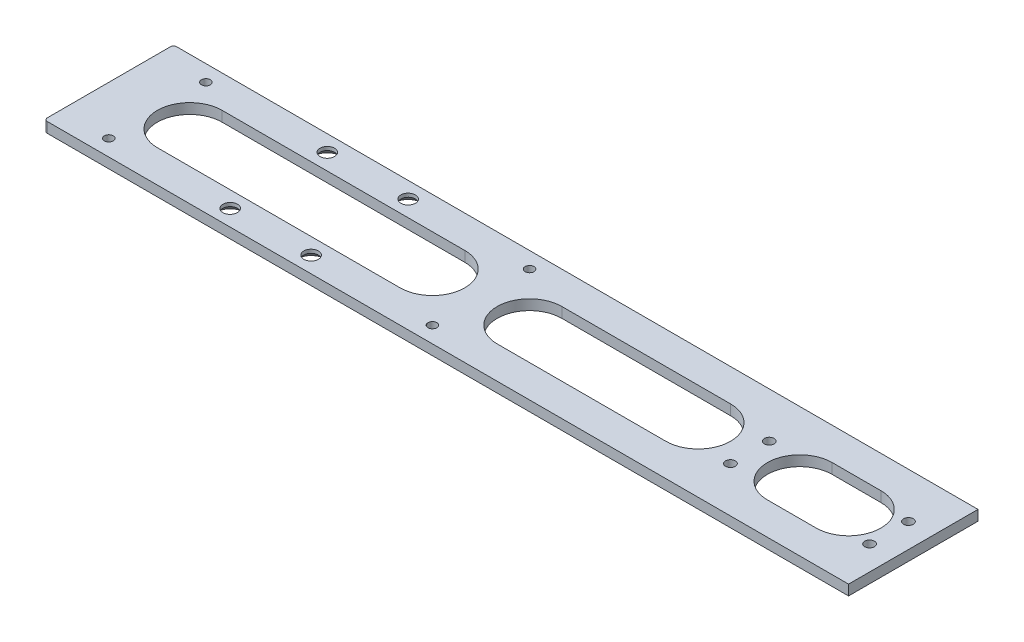
ISO-10303-21;
HEADER;
FILE_DESCRIPTION(('STEP AP214'),'2;1');
FILE_NAME('part.step','',(''),(''),'','','');
FILE_SCHEMA(('AUTOMOTIVE_DESIGN { 1 0 10303 214 1 1 1 1 }'));
ENDSEC;
DATA;
#1=APPLICATION_CONTEXT('core data for automotive mechanical design processes');
#2=APPLICATION_PROTOCOL_DEFINITION('international standard','automotive_design',2000,#1);
#3=PRODUCT_CONTEXT('',#1,'mechanical');
#4=PRODUCT('Part','Part','',(#3));
#5=PRODUCT_RELATED_PRODUCT_CATEGORY('part','',(#4));
#6=PRODUCT_DEFINITION_FORMATION('','',#4);
#7=PRODUCT_DEFINITION_CONTEXT('part definition',#1,'design');
#8=PRODUCT_DEFINITION('design','',#6,#7);
#9=PRODUCT_DEFINITION_SHAPE('','',#8);
#10=(LENGTH_UNIT() NAMED_UNIT(*) SI_UNIT(.MILLI.,.METRE.));
#11=(NAMED_UNIT(*) PLANE_ANGLE_UNIT() SI_UNIT($,.RADIAN.));
#12=(NAMED_UNIT(*) SI_UNIT($,.STERADIAN.) SOLID_ANGLE_UNIT());
#13=UNCERTAINTY_MEASURE_WITH_UNIT(LENGTH_MEASURE(1.E-05),#10,'distance_accuracy_value','');
#14=(GEOMETRIC_REPRESENTATION_CONTEXT(3) GLOBAL_UNCERTAINTY_ASSIGNED_CONTEXT((#13)) GLOBAL_UNIT_ASSIGNED_CONTEXT((#10,
#11,#12)) REPRESENTATION_CONTEXT('',''));
#15=CARTESIAN_POINT('',(0.,0.,0.));
#16=DIRECTION('',(0.,0.,1.));
#17=DIRECTION('',(1.,0.,0.));
#18=AXIS2_PLACEMENT_3D('',#15,#16,#17);
#19=CARTESIAN_POINT('',(5.22222222222225,12.7279220613579,35.5555555555555));
#20=DIRECTION('',(0.,-1.,0.));
#21=DIRECTION('',(0.,0.,-1.));
#22=AXIS2_PLACEMENT_3D('',#19,#20,#21);
#23=CYLINDRICAL_SURFACE('',#22,4.50000000000001);
#24=CARTESIAN_POINT('',(5.22222222222225,0.,35.5555555555555));
#25=DIRECTION('',(0.,1.,0.));
#26=DIRECTION('',(0.,0.,1.));
#27=AXIS2_PLACEMENT_3D('',#24,#25,#26);
#28=CIRCLE('',#27,4.50000000000001);
#29=CARTESIAN_POINT('',(5.22222222222225,0.,40.0555555555555));
#30=VERTEX_POINT('',#29);
#31=EDGE_CURVE('E378',#30,#30,#28,.T.);
#32=ORIENTED_EDGE('',*,*,#31,.T.);
#33=EDGE_LOOP('',(#32));
#34=FACE_BOUND('',#33,.T.);
#35=CARTESIAN_POINT('',(5.22222222222225,-2.2,35.5555555555555));
#36=DIRECTION('',(0.,-1.,0.));
#37=DIRECTION('',(0.,0.,-1.));
#38=AXIS2_PLACEMENT_3D('',#35,#36,#37);
#39=CIRCLE('',#38,4.5);
#40=CARTESIAN_POINT('',(5.22222222222225,-2.2,31.0555555555555));
#41=VERTEX_POINT('',#40);
#42=EDGE_CURVE('E669',#41,#41,#39,.T.);
#43=ORIENTED_EDGE('',*,*,#42,.T.);
#44=EDGE_LOOP('',(#43));
#45=FACE_BOUND('',#44,.T.);
#46=ADVANCED_FACE('F40',(#34,#45),#23,.F.);
#47=CARTESIAN_POINT('',(0.,-6.35,0.));
#48=DIRECTION('',(0.,1.,0.));
#49=DIRECTION('',(0.,0.,1.));
#50=AXIS2_PLACEMENT_3D('',#47,#48,#49);
#51=PLANE('',#50);
#52=CARTESIAN_POINT('',(5.22222222222225,-6.35,35.5555555555555));
#53=DIRECTION('',(0.,-1.,0.));
#54=DIRECTION('',(0.,0.,-1.));
#55=AXIS2_PLACEMENT_3D('',#52,#53,#54);
#56=CIRCLE('',#55,8.65);
#57=CARTESIAN_POINT('',(5.22222222222225,-6.35,26.9055555555555));
#58=VERTEX_POINT('',#57);
#59=EDGE_CURVE('E672',#58,#58,#56,.T.);
#60=ORIENTED_EDGE('',*,*,#59,.F.);
#61=EDGE_LOOP('',(#60));
#62=FACE_BOUND('',#61,.T.);
#63=CARTESIAN_POINT('',(-44.7777777777778,-6.35,35.5555555555555));
#64=DIRECTION('',(0.,-1.,0.));
#65=DIRECTION('',(0.,0.,-1.));
#66=AXIS2_PLACEMENT_3D('',#63,#64,#65);
#67=CIRCLE('',#66,8.65);
#68=CARTESIAN_POINT('',(-44.7777777777778,-6.35,26.9055555555555));
#69=VERTEX_POINT('',#68);
#70=EDGE_CURVE('E674',#69,#69,#67,.T.);
#71=ORIENTED_EDGE('',*,*,#70,.F.);
#72=EDGE_LOOP('',(#71));
#73=FACE_BOUND('',#72,.T.);
#74=CARTESIAN_POINT('',(-44.7777777777778,-6.35,-24.4444444444445));
#75=DIRECTION('',(0.,-1.,0.));
#76=DIRECTION('',(0.,0.,-1.));
#77=AXIS2_PLACEMENT_3D('',#74,#75,#76);
#78=CIRCLE('',#77,8.65);
#79=CARTESIAN_POINT('',(-44.7777777777778,-6.35,-33.0944444444445));
#80=VERTEX_POINT('',#79);
#81=EDGE_CURVE('E374',#80,#80,#78,.T.);
#82=ORIENTED_EDGE('',*,*,#81,.F.);
#83=EDGE_LOOP('',(#82));
#84=FACE_BOUND('',#83,.T.);
#85=DIRECTION('',(0.,0.,1.));
#86=VECTOR('',#85,1.);
#87=CARTESIAN_POINT('',(-149.777777777778,-6.35,-34.4444444444445));
#88=LINE('',#87,#86);
#89=CARTESIAN_POINT('',(-149.777777777778,-6.35,-32.4444444444445));
#90=VERTEX_POINT('',#89);
#91=CARTESIAN_POINT('',(-149.777777777778,-6.35,43.5555555555555));
#92=VERTEX_POINT('',#91);
#93=EDGE_CURVE('E259',#90,#92,#88,.T.);
#94=ORIENTED_EDGE('',*,*,#93,.F.);
#95=CARTESIAN_POINT('',(-147.777777777778,-6.35,-32.4444444444445));
#96=DIRECTION('',(0.,1.,0.));
#97=DIRECTION('',(0.,0.,1.));
#98=AXIS2_PLACEMENT_3D('',#95,#96,#97);
#99=CIRCLE('',#98,2.);
#100=CARTESIAN_POINT('',(-147.777777777778,-6.35,-34.4444444444445));
#101=VERTEX_POINT('',#100);
#102=EDGE_CURVE('E299',#90,#101,#99,.F.);
#103=ORIENTED_EDGE('',*,*,#102,.T.);
#104=DIRECTION('',(-1.,0.,0.));
#105=VECTOR('',#104,1.);
#106=CARTESIAN_POINT('',(-149.777777777778,-6.35,-34.4444444444445));
#107=LINE('',#106,#105);
#108=CARTESIAN_POINT('',(347.372222222222,-6.35,-34.4444444444445));
#109=VERTEX_POINT('',#108);
#110=EDGE_CURVE('E268',#109,#101,#107,.T.);
#111=ORIENTED_EDGE('',*,*,#110,.F.);
#112=DIRECTION('',(0.,0.,-1.));
#113=VECTOR('',#112,1.);
#114=CARTESIAN_POINT('',(347.372222222222,-6.35,-34.4444444444445));
#115=LINE('',#114,#113);
#116=CARTESIAN_POINT('',(347.372222222222,-6.35,45.5555555555555));
#117=VERTEX_POINT('',#116);
#118=EDGE_CURVE('E265',#117,#109,#115,.T.);
#119=ORIENTED_EDGE('',*,*,#118,.F.);
#120=DIRECTION('',(1.,0.,0.));
#121=VECTOR('',#120,1.);
#122=CARTESIAN_POINT('',(-149.777777777778,-6.35,45.5555555555555));
#123=LINE('',#122,#121);
#124=CARTESIAN_POINT('',(-147.777777777778,-6.35,45.5555555555555));
#125=VERTEX_POINT('',#124);
#126=EDGE_CURVE('E262',#125,#117,#123,.T.);
#127=ORIENTED_EDGE('',*,*,#126,.F.);
#128=CARTESIAN_POINT('',(-147.777777777778,-6.35,43.5555555555555));
#129=DIRECTION('',(0.,1.,0.));
#130=DIRECTION('',(0.,0.,1.));
#131=AXIS2_PLACEMENT_3D('',#128,#129,#130);
#132=CIRCLE('',#131,2.);
#133=EDGE_CURVE('E297',#125,#92,#132,.F.);
#134=ORIENTED_EDGE('',*,*,#133,.T.);
#135=EDGE_LOOP('',(#94,#103,#111,#119,#127,#134));
#136=FACE_BOUND('',#135,.T.);
#137=CARTESIAN_POINT('',(80.2222222222222,-6.35,-24.4444444444445));
#138=DIRECTION('',(0.,1.,0.));
#139=DIRECTION('',(0.,0.,1.));
#140=AXIS2_PLACEMENT_3D('',#137,#138,#139);
#141=CIRCLE('',#140,2.75);
#142=CARTESIAN_POINT('',(80.2222222222222,-6.35,-21.6944444444445));
#143=VERTEX_POINT('',#142);
#144=EDGE_CURVE('E255',#143,#143,#141,.T.);
#145=ORIENTED_EDGE('',*,*,#144,.T.);
#146=EDGE_LOOP('',(#145));
#147=FACE_BOUND('',#146,.T.);
#148=CARTESIAN_POINT('',(80.2222222222222,-6.35,35.5555555555555));
#149=DIRECTION('',(0.,1.,0.));
#150=DIRECTION('',(0.,0.,1.));
#151=AXIS2_PLACEMENT_3D('',#148,#149,#150);
#152=CIRCLE('',#151,2.75);
#153=CARTESIAN_POINT('',(80.2222222222222,-6.35,38.3055555555555));
#154=VERTEX_POINT('',#153);
#155=EDGE_CURVE('E249',#154,#154,#152,.T.);
#156=ORIENTED_EDGE('',*,*,#155,.T.);
#157=EDGE_LOOP('',(#156));
#158=FACE_BOUND('',#157,.T.);
#159=CARTESIAN_POINT('',(-119.777777777778,-6.35,35.5555555555555));
#160=DIRECTION('',(0.,1.,0.));
#161=DIRECTION('',(0.,0.,1.));
#162=AXIS2_PLACEMENT_3D('',#159,#160,#161);
#163=CIRCLE('',#162,2.75);
#164=CARTESIAN_POINT('',(-119.777777777778,-6.35,38.3055555555555));
#165=VERTEX_POINT('',#164);
#166=EDGE_CURVE('E243',#165,#165,#163,.T.);
#167=ORIENTED_EDGE('',*,*,#166,.T.);
#168=EDGE_LOOP('',(#167));
#169=FACE_BOUND('',#168,.T.);
#170=CARTESIAN_POINT('',(-119.777777777778,-6.35,-24.4444444444445));
#171=DIRECTION('',(0.,1.,0.));
#172=DIRECTION('',(0.,0.,1.));
#173=AXIS2_PLACEMENT_3D('',#170,#171,#172);
#174=CIRCLE('',#173,2.75);
#175=CARTESIAN_POINT('',(-119.777777777778,-6.35,-21.6944444444445));
#176=VERTEX_POINT('',#175);
#177=EDGE_CURVE('E237',#176,#176,#174,.T.);
#178=ORIENTED_EDGE('',*,*,#177,.T.);
#179=EDGE_LOOP('',(#178));
#180=FACE_BOUND('',#179,.T.);
#181=DIRECTION('',(-1.,0.,0.));
#182=VECTOR('',#181,1.);
#183=CARTESIAN_POINT('',(307.372222222222,-6.35,25.5555555555555));
#184=LINE('',#183,#182);
#185=CARTESIAN_POINT('',(307.372222222222,-6.35,25.5555555555555));
#186=VERTEX_POINT('',#185);
#187=CARTESIAN_POINT('',(277.234752082904,-6.35,25.5555555555555));
#188=VERTEX_POINT('',#187);
#189=EDGE_CURVE('E216',#186,#188,#184,.T.);
#190=ORIENTED_EDGE('',*,*,#189,.F.);
#191=CARTESIAN_POINT('',(307.372222222222,-6.35,5.55555555555554));
#192=DIRECTION('',(0.,-1.,0.));
#193=DIRECTION('',(0.,0.,-1.));
#194=AXIS2_PLACEMENT_3D('',#191,#192,#193);
#195=CIRCLE('',#194,20.);
#196=CARTESIAN_POINT('',(307.372222222222,-6.35,-14.4444444444445));
#197=VERTEX_POINT('',#196);
#198=EDGE_CURVE('E208',#197,#186,#195,.T.);
#199=ORIENTED_EDGE('',*,*,#198,.F.);
#200=DIRECTION('',(1.,0.,0.));
#201=VECTOR('',#200,1.);
#202=CARTESIAN_POINT('',(307.372222222222,-6.35,-14.4444444444445));
#203=LINE('',#202,#201);
#204=CARTESIAN_POINT('',(277.234752082904,-6.35,-14.4444444444445));
#205=VERTEX_POINT('',#204);
#206=EDGE_CURVE('E222',#205,#197,#203,.T.);
#207=ORIENTED_EDGE('',*,*,#206,.F.);
#208=CARTESIAN_POINT('',(277.234752082904,-6.35,5.55555555555554));
#209=DIRECTION('',(0.,-1.,0.));
#210=DIRECTION('',(0.,0.,-1.));
#211=AXIS2_PLACEMENT_3D('',#208,#209,#210);
#212=CIRCLE('',#211,20.);
#213=EDGE_CURVE('E219',#188,#205,#212,.T.);
#214=ORIENTED_EDGE('',*,*,#213,.F.);
#215=EDGE_LOOP('',(#190,#199,#207,#214));
#216=FACE_BOUND('',#215,.T.);
#217=DIRECTION('',(-1.,0.,0.));
#218=VECTOR('',#217,1.);
#219=CARTESIAN_POINT('',(50.2222222222222,-6.35,25.5555555555555));
#220=LINE('',#219,#218);
#221=CARTESIAN_POINT('',(50.2222222222222,-6.35,25.5555555555555));
#222=VERTEX_POINT('',#221);
#223=CARTESIAN_POINT('',(-99.7777777777778,-6.35,25.5555555555555));
#224=VERTEX_POINT('',#223);
#225=EDGE_CURVE('E196',#222,#224,#220,.T.);
#226=ORIENTED_EDGE('',*,*,#225,.F.);
#227=CARTESIAN_POINT('',(50.2222222222222,-6.35,5.55555555555554));
#228=DIRECTION('',(0.,-1.,0.));
#229=DIRECTION('',(0.,0.,-1.));
#230=AXIS2_PLACEMENT_3D('',#227,#228,#229);
#231=CIRCLE('',#230,20.);
#232=CARTESIAN_POINT('',(50.2222222222222,-6.35,-14.4444444444445));
#233=VERTEX_POINT('',#232);
#234=EDGE_CURVE('E192',#233,#222,#231,.T.);
#235=ORIENTED_EDGE('',*,*,#234,.F.);
#236=DIRECTION('',(1.,0.,0.));
#237=VECTOR('',#236,1.);
#238=CARTESIAN_POINT('',(50.2222222222222,-6.35,-14.4444444444445));
#239=LINE('',#238,#237);
#240=CARTESIAN_POINT('',(-99.7777777777778,-6.35,-14.4444444444445));
#241=VERTEX_POINT('',#240);
#242=EDGE_CURVE('E202',#241,#233,#239,.T.);
#243=ORIENTED_EDGE('',*,*,#242,.F.);
#244=CARTESIAN_POINT('',(-99.7777777777778,-6.35,5.55555555555554));
#245=DIRECTION('',(0.,-1.,0.));
#246=DIRECTION('',(0.,0.,-1.));
#247=AXIS2_PLACEMENT_3D('',#244,#245,#246);
#248=CIRCLE('',#247,20.);
#249=EDGE_CURVE('E199',#224,#241,#248,.T.);
#250=ORIENTED_EDGE('',*,*,#249,.F.);
#251=EDGE_LOOP('',(#226,#235,#243,#250));
#252=FACE_BOUND('',#251,.T.);
#253=DIRECTION('',(-1.,0.,0.));
#254=VECTOR('',#253,1.);
#255=CARTESIAN_POINT('',(214.481912447297,-6.35,25.5555555555555));
#256=LINE('',#255,#254);
#257=CARTESIAN_POINT('',(214.481912447297,-6.35,25.5555555555555));
#258=VERTEX_POINT('',#257);
#259=CARTESIAN_POINT('',(110.222222222222,-6.35,25.5555555555555));
#260=VERTEX_POINT('',#259);
#261=EDGE_CURVE('E178',#258,#260,#256,.T.);
#262=ORIENTED_EDGE('',*,*,#261,.F.);
#263=CARTESIAN_POINT('',(214.481912447297,-6.35,5.55555555555554));
#264=DIRECTION('',(0.,-1.,0.));
#265=DIRECTION('',(0.,0.,-1.));
#266=AXIS2_PLACEMENT_3D('',#263,#264,#265);
#267=CIRCLE('',#266,20.);
#268=CARTESIAN_POINT('',(214.481912447297,-6.35,-14.4444444444445));
#269=VERTEX_POINT('',#268);
#270=EDGE_CURVE('E57',#269,#258,#267,.T.);
#271=ORIENTED_EDGE('',*,*,#270,.F.);
#272=DIRECTION('',(1.,0.,0.));
#273=VECTOR('',#272,1.);
#274=CARTESIAN_POINT('',(214.481912447297,-6.35,-14.4444444444445));
#275=LINE('',#274,#273);
#276=CARTESIAN_POINT('',(110.222222222222,-6.35,-14.4444444444445));
#277=VERTEX_POINT('',#276);
#278=EDGE_CURVE('E185',#277,#269,#275,.T.);
#279=ORIENTED_EDGE('',*,*,#278,.F.);
#280=CARTESIAN_POINT('',(110.222222222222,-6.35,5.55555555555554));
#281=DIRECTION('',(0.,-1.,0.));
#282=DIRECTION('',(0.,0.,-1.));
#283=AXIS2_PLACEMENT_3D('',#280,#281,#282);
#284=CIRCLE('',#283,20.);
#285=EDGE_CURVE('E169',#260,#277,#284,.T.);
#286=ORIENTED_EDGE('',*,*,#285,.F.);
#287=EDGE_LOOP('',(#262,#271,#279,#286));
#288=FACE_BOUND('',#287,.T.);
#289=CARTESIAN_POINT('',(332.372222222222,-6.35,17.5555555555555));
#290=DIRECTION('',(0.,-1.,0.));
#291=DIRECTION('',(0.,0.,-1.));
#292=AXIS2_PLACEMENT_3D('',#289,#290,#291);
#293=CIRCLE('',#292,2.99999999999999);
#294=CARTESIAN_POINT('',(332.372222222222,-6.35,14.5555555555555));
#295=VERTEX_POINT('',#294);
#296=EDGE_CURVE('E328',#295,#295,#293,.T.);
#297=ORIENTED_EDGE('',*,*,#296,.F.);
#298=EDGE_LOOP('',(#297));
#299=FACE_BOUND('',#298,.T.);
#300=CARTESIAN_POINT('',(246.372222222222,-6.35,17.5555555555549));
#301=DIRECTION('',(0.,-1.,0.));
#302=DIRECTION('',(0.,0.,-1.));
#303=AXIS2_PLACEMENT_3D('',#300,#301,#302);
#304=CIRCLE('',#303,2.99999999999999);
#305=CARTESIAN_POINT('',(246.372222222222,-6.35,14.5555555555549));
#306=VERTEX_POINT('',#305);
#307=EDGE_CURVE('E331',#306,#306,#304,.T.);
#308=ORIENTED_EDGE('',*,*,#307,.F.);
#309=EDGE_LOOP('',(#308));
#310=FACE_BOUND('',#309,.T.);
#311=CARTESIAN_POINT('',(246.372222222222,-6.35,-6.44444444444506));
#312=DIRECTION('',(0.,-1.,0.));
#313=DIRECTION('',(0.,0.,-1.));
#314=AXIS2_PLACEMENT_3D('',#311,#312,#313);
#315=CIRCLE('',#314,2.99999999999999);
#316=CARTESIAN_POINT('',(246.372222222222,-6.35,-9.44444444444505));
#317=VERTEX_POINT('',#316);
#318=EDGE_CURVE('E334',#317,#317,#315,.T.);
#319=ORIENTED_EDGE('',*,*,#318,.F.);
#320=EDGE_LOOP('',(#319));
#321=FACE_BOUND('',#320,.T.);
#322=CARTESIAN_POINT('',(332.372222222222,-6.35,-6.44444444444446));
#323=DIRECTION('',(0.,-1.,0.));
#324=DIRECTION('',(0.,0.,-1.));
#325=AXIS2_PLACEMENT_3D('',#322,#323,#324);
#326=CIRCLE('',#325,2.99999999999999);
#327=CARTESIAN_POINT('',(332.372222222222,-6.35,-9.44444444444445));
#328=VERTEX_POINT('',#327);
#329=EDGE_CURVE('E344',#328,#328,#326,.T.);
#330=ORIENTED_EDGE('',*,*,#329,.F.);
#331=EDGE_LOOP('',(#330));
#332=FACE_BOUND('',#331,.T.);
#333=CARTESIAN_POINT('',(5.22222222222225,-6.35,-24.4444444444444));
#334=DIRECTION('',(0.,-1.,0.));
#335=DIRECTION('',(0.,0.,-1.));
#336=AXIS2_PLACEMENT_3D('',#333,#334,#335);
#337=CIRCLE('',#336,8.65);
#338=CARTESIAN_POINT('',(5.22222222222225,-6.35,-33.0944444444444));
#339=VERTEX_POINT('',#338);
#340=EDGE_CURVE('E365',#339,#339,#337,.T.);
#341=ORIENTED_EDGE('',*,*,#340,.F.);
#342=EDGE_LOOP('',(#341));
#343=FACE_BOUND('',#342,.T.);
#344=ADVANCED_FACE('F182',(#62,#73,#84,#136,#147,#158,#169,#180,#216,#252,#288,#299,#310,#321,
#332,#343),#51,.F.);
#345=CARTESIAN_POINT('',(0.,0.,0.));
#346=DIRECTION('',(0.,1.,0.));
#347=DIRECTION('',(0.,0.,1.));
#348=AXIS2_PLACEMENT_3D('',#345,#346,#347);
#349=PLANE('',#348);
#350=CARTESIAN_POINT('',(-44.7777777777778,0.,-24.4444444444445));
#351=DIRECTION('',(0.,1.,0.));
#352=DIRECTION('',(0.,0.,1.));
#353=AXIS2_PLACEMENT_3D('',#350,#351,#352);
#354=CIRCLE('',#353,4.5);
#355=CARTESIAN_POINT('',(-44.7777777777778,0.,-19.9444444444445));
#356=VERTEX_POINT('',#355);
#357=EDGE_CURVE('E371',#356,#356,#354,.F.);
#358=ORIENTED_EDGE('',*,*,#357,.T.);
#359=EDGE_LOOP('',(#358));
#360=FACE_BOUND('',#359,.T.);
#361=ORIENTED_EDGE('',*,*,#31,.F.);
#362=EDGE_LOOP('',(#361));
#363=FACE_BOUND('',#362,.T.);
#364=CARTESIAN_POINT('',(5.22222222222225,0.,-24.4444444444444));
#365=DIRECTION('',(0.,1.,0.));
#366=DIRECTION('',(0.,0.,1.));
#367=AXIS2_PLACEMENT_3D('',#364,#365,#366);
#368=CIRCLE('',#367,4.5);
#369=CARTESIAN_POINT('',(5.22222222222225,0.,-19.9444444444444));
#370=VERTEX_POINT('',#369);
#371=EDGE_CURVE('E381',#370,#370,#368,.F.);
#372=ORIENTED_EDGE('',*,*,#371,.T.);
#373=EDGE_LOOP('',(#372));
#374=FACE_BOUND('',#373,.T.);
#375=CARTESIAN_POINT('',(332.372222222222,0.,-6.44444444444446));
#376=DIRECTION('',(0.,1.,0.));
#377=DIRECTION('',(0.,0.,1.));
#378=AXIS2_PLACEMENT_3D('',#375,#376,#377);
#379=CIRCLE('',#378,2.99999999999999);
#380=CARTESIAN_POINT('',(332.372222222222,0.,-3.44444444444446));
#381=VERTEX_POINT('',#380);
#382=EDGE_CURVE('E44',#381,#381,#379,.T.);
#383=ORIENTED_EDGE('',*,*,#382,.F.);
#384=EDGE_LOOP('',(#383));
#385=FACE_BOUND('',#384,.T.);
#386=CARTESIAN_POINT('',(246.372222222222,0.,-6.44444444444506));
#387=DIRECTION('',(0.,1.,0.));
#388=DIRECTION('',(0.,0.,1.));
#389=AXIS2_PLACEMENT_3D('',#386,#387,#388);
#390=CIRCLE('',#389,2.99999999999999);
#391=CARTESIAN_POINT('',(246.372222222222,0.,-3.44444444444506));
#392=VERTEX_POINT('',#391);
#393=EDGE_CURVE('E332',#392,#392,#390,.T.);
#394=ORIENTED_EDGE('',*,*,#393,.F.);
#395=EDGE_LOOP('',(#394));
#396=FACE_BOUND('',#395,.T.);
#397=CARTESIAN_POINT('',(246.372222222222,0.,17.5555555555549));
#398=DIRECTION('',(0.,1.,0.));
#399=DIRECTION('',(0.,0.,1.));
#400=AXIS2_PLACEMENT_3D('',#397,#398,#399);
#401=CIRCLE('',#400,2.99999999999999);
#402=CARTESIAN_POINT('',(246.372222222222,0.,20.5555555555549));
#403=VERTEX_POINT('',#402);
#404=EDGE_CURVE('E329',#403,#403,#401,.T.);
#405=ORIENTED_EDGE('',*,*,#404,.F.);
#406=EDGE_LOOP('',(#405));
#407=FACE_BOUND('',#406,.T.);
#408=CARTESIAN_POINT('',(332.372222222222,0.,17.5555555555555));
#409=DIRECTION('',(0.,1.,0.));
#410=DIRECTION('',(0.,0.,1.));
#411=AXIS2_PLACEMENT_3D('',#408,#409,#410);
#412=CIRCLE('',#411,2.99999999999999);
#413=CARTESIAN_POINT('',(332.372222222222,0.,20.5555555555555));
#414=VERTEX_POINT('',#413);
#415=EDGE_CURVE('E325',#414,#414,#412,.T.);
#416=ORIENTED_EDGE('',*,*,#415,.F.);
#417=EDGE_LOOP('',(#416));
#418=FACE_BOUND('',#417,.T.);
#419=CARTESIAN_POINT('',(214.481912447297,0.,5.55555555555554));
#420=DIRECTION('',(0.,1.,0.));
#421=DIRECTION('',(0.,0.,1.));
#422=AXIS2_PLACEMENT_3D('',#419,#420,#421);
#423=CIRCLE('',#422,20.);
#424=CARTESIAN_POINT('',(214.481912447297,0.,25.5555555555555));
#425=VERTEX_POINT('',#424);
#426=CARTESIAN_POINT('',(214.481912447297,0.,-14.4444444444445));
#427=VERTEX_POINT('',#426);
#428=EDGE_CURVE('E11',#425,#427,#423,.T.);
#429=ORIENTED_EDGE('',*,*,#428,.F.);
#430=DIRECTION('',(1.,0.,0.));
#431=VECTOR('',#430,1.);
#432=CARTESIAN_POINT('',(0.,0.,25.5555555555555));
#433=LINE('',#432,#431);
#434=CARTESIAN_POINT('',(110.222222222222,0.,25.5555555555555));
#435=VERTEX_POINT('',#434);
#436=EDGE_CURVE('E321',#435,#425,#433,.T.);
#437=ORIENTED_EDGE('',*,*,#436,.F.);
#438=CARTESIAN_POINT('',(110.222222222222,0.,5.55555555555554));
#439=DIRECTION('',(0.,1.,0.));
#440=DIRECTION('',(0.,0.,1.));
#441=AXIS2_PLACEMENT_3D('',#438,#439,#440);
#442=CIRCLE('',#441,20.);
#443=CARTESIAN_POINT('',(110.222222222222,0.,-14.4444444444445));
#444=VERTEX_POINT('',#443);
#445=EDGE_CURVE('E172',#444,#435,#442,.T.);
#446=ORIENTED_EDGE('',*,*,#445,.F.);
#447=DIRECTION('',(-1.,0.,0.));
#448=VECTOR('',#447,1.);
#449=CARTESIAN_POINT('',(0.,0.,-14.4444444444445));
#450=LINE('',#449,#448);
#451=EDGE_CURVE('E49',#427,#444,#450,.T.);
#452=ORIENTED_EDGE('',*,*,#451,.F.);
#453=EDGE_LOOP('',(#429,#437,#446,#452));
#454=FACE_BOUND('',#453,.T.);
#455=CARTESIAN_POINT('',(50.2222222222222,0.,5.55555555555554));
#456=DIRECTION('',(0.,1.,0.));
#457=DIRECTION('',(0.,0.,1.));
#458=AXIS2_PLACEMENT_3D('',#455,#456,#457);
#459=CIRCLE('',#458,20.);
#460=CARTESIAN_POINT('',(50.2222222222222,0.,25.5555555555555));
#461=VERTEX_POINT('',#460);
#462=CARTESIAN_POINT('',(50.2222222222222,0.,-14.4444444444445));
#463=VERTEX_POINT('',#462);
#464=EDGE_CURVE('E319',#461,#463,#459,.T.);
#465=ORIENTED_EDGE('',*,*,#464,.F.);
#466=DIRECTION('',(1.,0.,0.));
#467=VECTOR('',#466,1.);
#468=CARTESIAN_POINT('',(0.,0.,25.5555555555555));
#469=LINE('',#468,#467);
#470=CARTESIAN_POINT('',(-99.7777777777778,0.,25.5555555555555));
#471=VERTEX_POINT('',#470);
#472=EDGE_CURVE('E312',#471,#461,#469,.T.);
#473=ORIENTED_EDGE('',*,*,#472,.F.);
#474=CARTESIAN_POINT('',(-99.7777777777778,0.,5.55555555555554));
#475=DIRECTION('',(0.,1.,0.));
#476=DIRECTION('',(0.,0.,1.));
#477=AXIS2_PLACEMENT_3D('',#474,#475,#476);
#478=CIRCLE('',#477,20.);
#479=CARTESIAN_POINT('',(-99.7777777777778,0.,-14.4444444444445));
#480=VERTEX_POINT('',#479);
#481=EDGE_CURVE('E314',#480,#471,#478,.T.);
#482=ORIENTED_EDGE('',*,*,#481,.F.);
#483=DIRECTION('',(-1.,0.,0.));
#484=VECTOR('',#483,1.);
#485=CARTESIAN_POINT('',(0.,0.,-14.4444444444445));
#486=LINE('',#485,#484);
#487=EDGE_CURVE('E317',#463,#480,#486,.T.);
#488=ORIENTED_EDGE('',*,*,#487,.F.);
#489=EDGE_LOOP('',(#465,#473,#482,#488));
#490=FACE_BOUND('',#489,.T.);
#491=CARTESIAN_POINT('',(307.372222222222,0.,5.55555555555554));
#492=DIRECTION('',(0.,1.,0.));
#493=DIRECTION('',(0.,0.,1.));
#494=AXIS2_PLACEMENT_3D('',#491,#492,#493);
#495=CIRCLE('',#494,20.);
#496=CARTESIAN_POINT('',(307.372222222222,0.,25.5555555555555));
#497=VERTEX_POINT('',#496);
#498=CARTESIAN_POINT('',(307.372222222222,0.,-14.4444444444445));
#499=VERTEX_POINT('',#498);
#500=EDGE_CURVE('E310',#497,#499,#495,.T.);
#501=ORIENTED_EDGE('',*,*,#500,.F.);
#502=DIRECTION('',(1.,0.,0.));
#503=VECTOR('',#502,1.);
#504=CARTESIAN_POINT('',(0.,0.,25.5555555555555));
#505=LINE('',#504,#503);
#506=CARTESIAN_POINT('',(277.234752082904,0.,25.5555555555555));
#507=VERTEX_POINT('',#506);
#508=EDGE_CURVE('E303',#507,#497,#505,.T.);
#509=ORIENTED_EDGE('',*,*,#508,.F.);
#510=CARTESIAN_POINT('',(277.234752082904,0.,5.55555555555554));
#511=DIRECTION('',(0.,1.,0.));
#512=DIRECTION('',(0.,0.,1.));
#513=AXIS2_PLACEMENT_3D('',#510,#511,#512);
#514=CIRCLE('',#513,20.);
#515=CARTESIAN_POINT('',(277.234752082904,0.,-14.4444444444445));
#516=VERTEX_POINT('',#515);
#517=EDGE_CURVE('E305',#516,#507,#514,.T.);
#518=ORIENTED_EDGE('',*,*,#517,.F.);
#519=DIRECTION('',(-1.,0.,0.));
#520=VECTOR('',#519,1.);
#521=CARTESIAN_POINT('',(0.,0.,-14.4444444444445));
#522=LINE('',#521,#520);
#523=EDGE_CURVE('E308',#499,#516,#522,.T.);
#524=ORIENTED_EDGE('',*,*,#523,.F.);
#525=EDGE_LOOP('',(#501,#509,#518,#524));
#526=FACE_BOUND('',#525,.T.);
#527=CARTESIAN_POINT('',(-119.777777777778,0.,-24.4444444444445));
#528=DIRECTION('',(0.,1.,0.));
#529=DIRECTION('',(0.,0.,1.));
#530=AXIS2_PLACEMENT_3D('',#527,#528,#529);
#531=CIRCLE('',#530,2.75);
#532=CARTESIAN_POINT('',(-119.777777777778,0.,-21.6944444444445));
#533=VERTEX_POINT('',#532);
#534=EDGE_CURVE('E228',#533,#533,#531,.T.);
#535=ORIENTED_EDGE('',*,*,#534,.F.);
#536=EDGE_LOOP('',(#535));
#537=FACE_BOUND('',#536,.T.);
#538=CARTESIAN_POINT('',(-119.777777777778,0.,35.5555555555555));
#539=DIRECTION('',(0.,1.,0.));
#540=DIRECTION('',(0.,0.,1.));
#541=AXIS2_PLACEMENT_3D('',#538,#539,#540);
#542=CIRCLE('',#541,2.75);
#543=CARTESIAN_POINT('',(-119.777777777778,0.,38.3055555555555));
#544=VERTEX_POINT('',#543);
#545=EDGE_CURVE('E240',#544,#544,#542,.T.);
#546=ORIENTED_EDGE('',*,*,#545,.F.);
#547=EDGE_LOOP('',(#546));
#548=FACE_BOUND('',#547,.T.);
#549=CARTESIAN_POINT('',(80.2222222222222,0.,35.5555555555555));
#550=DIRECTION('',(0.,1.,0.));
#551=DIRECTION('',(0.,0.,1.));
#552=AXIS2_PLACEMENT_3D('',#549,#550,#551);
#553=CIRCLE('',#552,2.75);
#554=CARTESIAN_POINT('',(80.2222222222222,0.,38.3055555555555));
#555=VERTEX_POINT('',#554);
#556=EDGE_CURVE('E246',#555,#555,#553,.T.);
#557=ORIENTED_EDGE('',*,*,#556,.F.);
#558=EDGE_LOOP('',(#557));
#559=FACE_BOUND('',#558,.T.);
#560=CARTESIAN_POINT('',(80.2222222222222,0.,-24.4444444444445));
#561=DIRECTION('',(0.,1.,0.));
#562=DIRECTION('',(0.,0.,1.));
#563=AXIS2_PLACEMENT_3D('',#560,#561,#562);
#564=CIRCLE('',#563,2.75);
#565=CARTESIAN_POINT('',(80.2222222222222,0.,-21.6944444444445));
#566=VERTEX_POINT('',#565);
#567=EDGE_CURVE('E252',#566,#566,#564,.T.);
#568=ORIENTED_EDGE('',*,*,#567,.F.);
#569=EDGE_LOOP('',(#568));
#570=FACE_BOUND('',#569,.T.);
#571=DIRECTION('',(-1.,0.,0.));
#572=VECTOR('',#571,1.);
#573=CARTESIAN_POINT('',(-149.777777777778,0.,-34.4444444444445));
#574=LINE('',#573,#572);
#575=CARTESIAN_POINT('',(347.372222222222,0.,-34.4444444444445));
#576=VERTEX_POINT('',#575);
#577=CARTESIAN_POINT('',(-147.777777777778,0.,-34.4444444444445));
#578=VERTEX_POINT('',#577);
#579=EDGE_CURVE('E263',#576,#578,#574,.T.);
#580=ORIENTED_EDGE('',*,*,#579,.T.);
#581=CARTESIAN_POINT('',(-147.777777777778,0.,-32.4444444444445));
#582=DIRECTION('',(0.,1.,0.));
#583=DIRECTION('',(0.,0.,1.));
#584=AXIS2_PLACEMENT_3D('',#581,#582,#583);
#585=CIRCLE('',#584,2.);
#586=CARTESIAN_POINT('',(-149.777777777778,0.,-32.4444444444445));
#587=VERTEX_POINT('',#586);
#588=EDGE_CURVE('E290',#578,#587,#585,.T.);
#589=ORIENTED_EDGE('',*,*,#588,.T.);
#590=DIRECTION('',(0.,0.,1.));
#591=VECTOR('',#590,1.);
#592=CARTESIAN_POINT('',(-149.777777777778,0.,-34.4444444444445));
#593=LINE('',#592,#591);
#594=CARTESIAN_POINT('',(-149.777777777778,0.,43.5555555555555));
#595=VERTEX_POINT('',#594);
#596=EDGE_CURVE('E258',#587,#595,#593,.T.);
#597=ORIENTED_EDGE('',*,*,#596,.T.);
#598=CARTESIAN_POINT('',(-147.777777777778,0.,43.5555555555555));
#599=DIRECTION('',(0.,1.,0.));
#600=DIRECTION('',(0.,0.,1.));
#601=AXIS2_PLACEMENT_3D('',#598,#599,#600);
#602=CIRCLE('',#601,2.);
#603=CARTESIAN_POINT('',(-147.777777777778,0.,45.5555555555555));
#604=VERTEX_POINT('',#603);
#605=EDGE_CURVE('E288',#595,#604,#602,.T.);
#606=ORIENTED_EDGE('',*,*,#605,.T.);
#607=DIRECTION('',(1.,0.,0.));
#608=VECTOR('',#607,1.);
#609=CARTESIAN_POINT('',(-149.777777777778,0.,45.5555555555555));
#610=LINE('',#609,#608);
#611=CARTESIAN_POINT('',(347.372222222222,0.,45.5555555555555));
#612=VERTEX_POINT('',#611);
#613=EDGE_CURVE('E274',#604,#612,#610,.T.);
#614=ORIENTED_EDGE('',*,*,#613,.T.);
#615=DIRECTION('',(0.,0.,-1.));
#616=VECTOR('',#615,1.);
#617=CARTESIAN_POINT('',(347.372222222222,0.,-34.4444444444445));
#618=LINE('',#617,#616);
#619=EDGE_CURVE('E276',#612,#576,#618,.T.);
#620=ORIENTED_EDGE('',*,*,#619,.T.);
#621=EDGE_LOOP('',(#580,#589,#597,#606,#614,#620));
#622=FACE_BOUND('',#621,.T.);
#623=CARTESIAN_POINT('',(-44.7777777777778,0.,35.5555555555555));
#624=DIRECTION('',(0.,1.,0.));
#625=DIRECTION('',(0.,0.,1.));
#626=AXIS2_PLACEMENT_3D('',#623,#624,#625);
#627=CIRCLE('',#626,4.5);
#628=CARTESIAN_POINT('',(-44.7777777777778,0.,40.0555555555555));
#629=VERTEX_POINT('',#628);
#630=EDGE_CURVE('E382',#629,#629,#627,.T.);
#631=ORIENTED_EDGE('',*,*,#630,.F.);
#632=EDGE_LOOP('',(#631));
#633=FACE_BOUND('',#632,.T.);
#634=ADVANCED_FACE('F354',(#360,#363,#374,#385,#396,#407,#418,#454,#490,#526,#537,#548,#559,
#570,#622,#633),#349,.T.);
#635=CARTESIAN_POINT('',(-149.777777777778,-6.35,-34.4444444444445));
#636=DIRECTION('',(-1.,0.,0.));
#637=DIRECTION('',(0.,0.,1.));
#638=AXIS2_PLACEMENT_3D('',#635,#636,#637);
#639=PLANE('',#638);
#640=ORIENTED_EDGE('',*,*,#596,.F.);
#641=DIRECTION('',(0.,1.,0.));
#642=VECTOR('',#641,1.);
#643=CARTESIAN_POINT('',(-149.777777777778,-6.35,-32.4444444444445));
#644=LINE('',#643,#642);
#645=EDGE_CURVE('E295',#587,#90,#644,.F.);
#646=ORIENTED_EDGE('',*,*,#645,.T.);
#647=ORIENTED_EDGE('',*,*,#93,.T.);
#648=DIRECTION('',(0.,1.,0.));
#649=VECTOR('',#648,1.);
#650=CARTESIAN_POINT('',(-149.777777777778,-6.35,43.5555555555555));
#651=LINE('',#650,#649);
#652=EDGE_CURVE('E292',#92,#595,#651,.T.);
#653=ORIENTED_EDGE('',*,*,#652,.T.);
#654=EDGE_LOOP('',(#640,#646,#647,#653));
#655=FACE_BOUND('',#654,.T.);
#656=ADVANCED_FACE('F432',(#655),#639,.T.);
#657=CARTESIAN_POINT('',(-149.777777777778,-6.35,-34.4444444444445));
#658=DIRECTION('',(0.,0.,-1.));
#659=DIRECTION('',(-1.,0.,0.));
#660=AXIS2_PLACEMENT_3D('',#657,#658,#659);
#661=PLANE('',#660);
#662=ORIENTED_EDGE('',*,*,#110,.T.);
#663=DIRECTION('',(0.,1.,0.));
#664=VECTOR('',#663,1.);
#665=CARTESIAN_POINT('',(-147.777777777778,-6.35,-34.4444444444445));
#666=LINE('',#665,#664);
#667=EDGE_CURVE('E283',#101,#578,#666,.T.);
#668=ORIENTED_EDGE('',*,*,#667,.T.);
#669=ORIENTED_EDGE('',*,*,#579,.F.);
#670=DIRECTION('',(0.,1.,0.));
#671=VECTOR('',#670,1.);
#672=CARTESIAN_POINT('',(347.372222222222,-6.35,-34.4444444444445));
#673=LINE('',#672,#671);
#674=EDGE_CURVE('E281',#109,#576,#673,.T.);
#675=ORIENTED_EDGE('',*,*,#674,.F.);
#676=EDGE_LOOP('',(#662,#668,#669,#675));
#677=FACE_BOUND('',#676,.T.);
#678=ADVANCED_FACE('F469',(#677),#661,.T.);
#679=CARTESIAN_POINT('',(347.372222222222,-6.35,-34.4444444444445));
#680=DIRECTION('',(1.,0.,0.));
#681=DIRECTION('',(0.,0.,-1.));
#682=AXIS2_PLACEMENT_3D('',#679,#680,#681);
#683=PLANE('',#682);
#684=ORIENTED_EDGE('',*,*,#619,.F.);
#685=DIRECTION('',(0.,1.,0.));
#686=VECTOR('',#685,1.);
#687=CARTESIAN_POINT('',(347.372222222222,-6.35,45.5555555555555));
#688=LINE('',#687,#686);
#689=EDGE_CURVE('E271',#117,#612,#688,.T.);
#690=ORIENTED_EDGE('',*,*,#689,.F.);
#691=ORIENTED_EDGE('',*,*,#118,.T.);
#692=ORIENTED_EDGE('',*,*,#674,.T.);
#693=EDGE_LOOP('',(#684,#690,#691,#692));
#694=FACE_BOUND('',#693,.T.);
#695=ADVANCED_FACE('F491',(#694),#683,.T.);
#696=CARTESIAN_POINT('',(-149.777777777778,-6.35,45.5555555555555));
#697=DIRECTION('',(0.,0.,1.));
#698=DIRECTION('',(1.,0.,0.));
#699=AXIS2_PLACEMENT_3D('',#696,#697,#698);
#700=PLANE('',#699);
#701=ORIENTED_EDGE('',*,*,#613,.F.);
#702=DIRECTION('',(0.,1.,0.));
#703=VECTOR('',#702,1.);
#704=CARTESIAN_POINT('',(-147.777777777778,-6.35,45.5555555555555));
#705=LINE('',#704,#703);
#706=EDGE_CURVE('E301',#604,#125,#705,.F.);
#707=ORIENTED_EDGE('',*,*,#706,.T.);
#708=ORIENTED_EDGE('',*,*,#126,.T.);
#709=ORIENTED_EDGE('',*,*,#689,.T.);
#710=EDGE_LOOP('',(#701,#707,#708,#709));
#711=FACE_BOUND('',#710,.T.);
#712=ADVANCED_FACE('F488',(#711),#700,.T.);
#713=CARTESIAN_POINT('',(-147.777777777778,-6.35,-32.4444444444445));
#714=DIRECTION('',(0.,1.,0.));
#715=DIRECTION('',(0.,0.,1.));
#716=AXIS2_PLACEMENT_3D('',#713,#714,#715);
#717=CYLINDRICAL_SURFACE('',#716,2.);
#718=ORIENTED_EDGE('',*,*,#102,.F.);
#719=ORIENTED_EDGE('',*,*,#645,.F.);
#720=ORIENTED_EDGE('',*,*,#588,.F.);
#721=ORIENTED_EDGE('',*,*,#667,.F.);
#722=EDGE_LOOP('',(#718,#719,#720,#721));
#723=FACE_BOUND('',#722,.T.);
#724=ADVANCED_FACE('F474',(#723),#717,.T.);
#725=CARTESIAN_POINT('',(-147.777777777778,-6.35,43.5555555555555));
#726=DIRECTION('',(0.,1.,0.));
#727=DIRECTION('',(0.,0.,1.));
#728=AXIS2_PLACEMENT_3D('',#725,#726,#727);
#729=CYLINDRICAL_SURFACE('',#728,2.);
#730=ORIENTED_EDGE('',*,*,#133,.F.);
#731=ORIENTED_EDGE('',*,*,#706,.F.);
#732=ORIENTED_EDGE('',*,*,#605,.F.);
#733=ORIENTED_EDGE('',*,*,#652,.F.);
#734=EDGE_LOOP('',(#730,#731,#732,#733));
#735=FACE_BOUND('',#734,.T.);
#736=ADVANCED_FACE('F42',(#735),#729,.T.);
#737=CARTESIAN_POINT('',(80.2222222222222,0.,-24.4444444444445));
#738=DIRECTION('',(0.,1.,0.));
#739=DIRECTION('',(0.,0.,1.));
#740=AXIS2_PLACEMENT_3D('',#737,#738,#739);
#741=CYLINDRICAL_SURFACE('',#740,2.75);
#742=ORIENTED_EDGE('',*,*,#144,.F.);
#743=EDGE_LOOP('',(#742));
#744=FACE_BOUND('',#743,.T.);
#745=ORIENTED_EDGE('',*,*,#567,.T.);
#746=EDGE_LOOP('',(#745));
#747=FACE_BOUND('',#746,.T.);
#748=ADVANCED_FACE('F506',(#744,#747),#741,.F.);
#749=CARTESIAN_POINT('',(80.2222222222222,0.,35.5555555555555));
#750=DIRECTION('',(0.,1.,0.));
#751=DIRECTION('',(0.,0.,1.));
#752=AXIS2_PLACEMENT_3D('',#749,#750,#751);
#753=CYLINDRICAL_SURFACE('',#752,2.75);
#754=ORIENTED_EDGE('',*,*,#155,.F.);
#755=EDGE_LOOP('',(#754));
#756=FACE_BOUND('',#755,.T.);
#757=ORIENTED_EDGE('',*,*,#556,.T.);
#758=EDGE_LOOP('',(#757));
#759=FACE_BOUND('',#758,.T.);
#760=ADVANCED_FACE('F510',(#756,#759),#753,.F.);
#761=CARTESIAN_POINT('',(-119.777777777778,0.,35.5555555555555));
#762=DIRECTION('',(0.,1.,0.));
#763=DIRECTION('',(0.,0.,1.));
#764=AXIS2_PLACEMENT_3D('',#761,#762,#763);
#765=CYLINDRICAL_SURFACE('',#764,2.75);
#766=ORIENTED_EDGE('',*,*,#166,.F.);
#767=EDGE_LOOP('',(#766));
#768=FACE_BOUND('',#767,.T.);
#769=ORIENTED_EDGE('',*,*,#545,.T.);
#770=EDGE_LOOP('',(#769));
#771=FACE_BOUND('',#770,.T.);
#772=ADVANCED_FACE('F516',(#768,#771),#765,.F.);
#773=CARTESIAN_POINT('',(-119.777777777778,0.,-24.4444444444445));
#774=DIRECTION('',(0.,1.,0.));
#775=DIRECTION('',(0.,0.,1.));
#776=AXIS2_PLACEMENT_3D('',#773,#774,#775);
#777=CYLINDRICAL_SURFACE('',#776,2.75);
#778=ORIENTED_EDGE('',*,*,#177,.F.);
#779=EDGE_LOOP('',(#778));
#780=FACE_BOUND('',#779,.T.);
#781=ORIENTED_EDGE('',*,*,#534,.T.);
#782=EDGE_LOOP('',(#781));
#783=FACE_BOUND('',#782,.T.);
#784=ADVANCED_FACE('F524',(#780,#783),#777,.F.);
#785=CARTESIAN_POINT('',(307.372222222222,3.65,5.55555555555554));
#786=DIRECTION('',(0.,-1.,0.));
#787=DIRECTION('',(0.,0.,-1.));
#788=AXIS2_PLACEMENT_3D('',#785,#786,#787);
#789=CYLINDRICAL_SURFACE('',#788,20.);
#790=ORIENTED_EDGE('',*,*,#500,.T.);
#791=DIRECTION('',(0.,-1.,0.));
#792=VECTOR('',#791,1.);
#793=CARTESIAN_POINT('',(307.372222222222,3.65,-14.4444444444445));
#794=LINE('',#793,#792);
#795=EDGE_CURVE('E226',#499,#197,#794,.T.);
#796=ORIENTED_EDGE('',*,*,#795,.T.);
#797=ORIENTED_EDGE('',*,*,#198,.T.);
#798=DIRECTION('',(0.,-1.,0.));
#799=VECTOR('',#798,1.);
#800=CARTESIAN_POINT('',(307.372222222222,3.65,25.5555555555555));
#801=LINE('',#800,#799);
#802=EDGE_CURVE('E225',#497,#186,#801,.T.);
#803=ORIENTED_EDGE('',*,*,#802,.F.);
#804=EDGE_LOOP('',(#790,#796,#797,#803));
#805=FACE_BOUND('',#804,.T.);
#806=ADVANCED_FACE('F528',(#805),#789,.F.);
#807=CARTESIAN_POINT('',(307.372222222222,3.65,-14.4444444444445));
#808=DIRECTION('',(0.,0.,-1.));
#809=DIRECTION('',(-1.,0.,0.));
#810=AXIS2_PLACEMENT_3D('',#807,#808,#809);
#811=PLANE('',#810);
#812=ORIENTED_EDGE('',*,*,#523,.T.);
#813=DIRECTION('',(0.,-1.,0.));
#814=VECTOR('',#813,1.);
#815=CARTESIAN_POINT('',(277.234752082904,3.65,-14.4444444444445));
#816=LINE('',#815,#814);
#817=EDGE_CURVE('E229',#516,#205,#816,.T.);
#818=ORIENTED_EDGE('',*,*,#817,.T.);
#819=ORIENTED_EDGE('',*,*,#206,.T.);
#820=ORIENTED_EDGE('',*,*,#795,.F.);
#821=EDGE_LOOP('',(#812,#818,#819,#820));
#822=FACE_BOUND('',#821,.T.);
#823=ADVANCED_FACE('F532',(#822),#811,.F.);
#824=CARTESIAN_POINT('',(277.234752082904,3.65,5.55555555555554));
#825=DIRECTION('',(0.,-1.,0.));
#826=DIRECTION('',(0.,0.,-1.));
#827=AXIS2_PLACEMENT_3D('',#824,#825,#826);
#828=CYLINDRICAL_SURFACE('',#827,20.);
#829=ORIENTED_EDGE('',*,*,#517,.T.);
#830=DIRECTION('',(0.,-1.,0.));
#831=VECTOR('',#830,1.);
#832=CARTESIAN_POINT('',(277.234752082904,3.65,25.5555555555555));
#833=LINE('',#832,#831);
#834=EDGE_CURVE('E231',#507,#188,#833,.T.);
#835=ORIENTED_EDGE('',*,*,#834,.T.);
#836=ORIENTED_EDGE('',*,*,#213,.T.);
#837=ORIENTED_EDGE('',*,*,#817,.F.);
#838=EDGE_LOOP('',(#829,#835,#836,#837));
#839=FACE_BOUND('',#838,.T.);
#840=ADVANCED_FACE('F538',(#839),#828,.F.);
#841=CARTESIAN_POINT('',(307.372222222222,3.65,25.5555555555555));
#842=DIRECTION('',(0.,0.,1.));
#843=DIRECTION('',(1.,0.,0.));
#844=AXIS2_PLACEMENT_3D('',#841,#842,#843);
#845=PLANE('',#844);
#846=ORIENTED_EDGE('',*,*,#508,.T.);
#847=ORIENTED_EDGE('',*,*,#802,.T.);
#848=ORIENTED_EDGE('',*,*,#189,.T.);
#849=ORIENTED_EDGE('',*,*,#834,.F.);
#850=EDGE_LOOP('',(#846,#847,#848,#849));
#851=FACE_BOUND('',#850,.T.);
#852=ADVANCED_FACE('F534',(#851),#845,.F.);
#853=CARTESIAN_POINT('',(50.2222222222222,3.65,5.55555555555554));
#854=DIRECTION('',(0.,-1.,0.));
#855=DIRECTION('',(0.,0.,-1.));
#856=AXIS2_PLACEMENT_3D('',#853,#854,#855);
#857=CYLINDRICAL_SURFACE('',#856,20.);
#858=ORIENTED_EDGE('',*,*,#464,.T.);
#859=DIRECTION('',(0.,-1.,0.));
#860=VECTOR('',#859,1.);
#861=CARTESIAN_POINT('',(50.2222222222222,3.65,-14.4444444444445));
#862=LINE('',#861,#860);
#863=EDGE_CURVE('E206',#463,#233,#862,.T.);
#864=ORIENTED_EDGE('',*,*,#863,.T.);
#865=ORIENTED_EDGE('',*,*,#234,.T.);
#866=DIRECTION('',(0.,-1.,0.));
#867=VECTOR('',#866,1.);
#868=CARTESIAN_POINT('',(50.2222222222222,3.65,25.5555555555555));
#869=LINE('',#868,#867);
#870=EDGE_CURVE('E205',#461,#222,#869,.T.);
#871=ORIENTED_EDGE('',*,*,#870,.F.);
#872=EDGE_LOOP('',(#858,#864,#865,#871));
#873=FACE_BOUND('',#872,.T.);
#874=ADVANCED_FACE('F537',(#873),#857,.F.);
#875=CARTESIAN_POINT('',(50.2222222222222,3.65,-14.4444444444445));
#876=DIRECTION('',(0.,0.,-1.));
#877=DIRECTION('',(-1.,0.,0.));
#878=AXIS2_PLACEMENT_3D('',#875,#876,#877);
#879=PLANE('',#878);
#880=ORIENTED_EDGE('',*,*,#487,.T.);
#881=DIRECTION('',(0.,-1.,0.));
#882=VECTOR('',#881,1.);
#883=CARTESIAN_POINT('',(-99.7777777777778,3.65,-14.4444444444445));
#884=LINE('',#883,#882);
#885=EDGE_CURVE('E209',#480,#241,#884,.T.);
#886=ORIENTED_EDGE('',*,*,#885,.T.);
#887=ORIENTED_EDGE('',*,*,#242,.T.);
#888=ORIENTED_EDGE('',*,*,#863,.F.);
#889=EDGE_LOOP('',(#880,#886,#887,#888));
#890=FACE_BOUND('',#889,.T.);
#891=ADVANCED_FACE('F548',(#890),#879,.F.);
#892=CARTESIAN_POINT('',(-99.7777777777778,3.65,5.55555555555554));
#893=DIRECTION('',(0.,-1.,0.));
#894=DIRECTION('',(0.,0.,-1.));
#895=AXIS2_PLACEMENT_3D('',#892,#893,#894);
#896=CYLINDRICAL_SURFACE('',#895,20.);
#897=ORIENTED_EDGE('',*,*,#481,.T.);
#898=DIRECTION('',(0.,-1.,0.));
#899=VECTOR('',#898,1.);
#900=CARTESIAN_POINT('',(-99.7777777777778,3.65,25.5555555555555));
#901=LINE('',#900,#899);
#902=EDGE_CURVE('E211',#471,#224,#901,.T.);
#903=ORIENTED_EDGE('',*,*,#902,.T.);
#904=ORIENTED_EDGE('',*,*,#249,.T.);
#905=ORIENTED_EDGE('',*,*,#885,.F.);
#906=EDGE_LOOP('',(#897,#903,#904,#905));
#907=FACE_BOUND('',#906,.T.);
#908=ADVANCED_FACE('F554',(#907),#896,.F.);
#909=CARTESIAN_POINT('',(50.2222222222222,3.65,25.5555555555555));
#910=DIRECTION('',(0.,0.,1.));
#911=DIRECTION('',(1.,0.,0.));
#912=AXIS2_PLACEMENT_3D('',#909,#910,#911);
#913=PLANE('',#912);
#914=ORIENTED_EDGE('',*,*,#472,.T.);
#915=ORIENTED_EDGE('',*,*,#870,.T.);
#916=ORIENTED_EDGE('',*,*,#225,.T.);
#917=ORIENTED_EDGE('',*,*,#902,.F.);
#918=EDGE_LOOP('',(#914,#915,#916,#917));
#919=FACE_BOUND('',#918,.T.);
#920=ADVANCED_FACE('F550',(#919),#913,.F.);
#921=CARTESIAN_POINT('',(214.481912447297,3.65,5.55555555555554));
#922=DIRECTION('',(0.,-1.,0.));
#923=DIRECTION('',(0.,0.,-1.));
#924=AXIS2_PLACEMENT_3D('',#921,#922,#923);
#925=CYLINDRICAL_SURFACE('',#924,20.);
#926=ORIENTED_EDGE('',*,*,#428,.T.);
#927=DIRECTION('',(0.,-1.,0.));
#928=VECTOR('',#927,1.);
#929=CARTESIAN_POINT('',(214.481912447297,3.65,-14.4444444444445));
#930=LINE('',#929,#928);
#931=EDGE_CURVE('E190',#427,#269,#930,.T.);
#932=ORIENTED_EDGE('',*,*,#931,.T.);
#933=ORIENTED_EDGE('',*,*,#270,.T.);
#934=DIRECTION('',(0.,-1.,0.));
#935=VECTOR('',#934,1.);
#936=CARTESIAN_POINT('',(214.481912447297,3.65,25.5555555555555));
#937=LINE('',#936,#935);
#938=EDGE_CURVE('E175',#425,#258,#937,.T.);
#939=ORIENTED_EDGE('',*,*,#938,.F.);
#940=EDGE_LOOP('',(#926,#932,#933,#939));
#941=FACE_BOUND('',#940,.T.);
#942=ADVANCED_FACE('F553',(#941),#925,.F.);
#943=CARTESIAN_POINT('',(214.481912447297,3.65,-14.4444444444445));
#944=DIRECTION('',(0.,0.,-1.));
#945=DIRECTION('',(-1.,0.,0.));
#946=AXIS2_PLACEMENT_3D('',#943,#944,#945);
#947=PLANE('',#946);
#948=ORIENTED_EDGE('',*,*,#451,.T.);
#949=DIRECTION('',(0.,-1.,0.));
#950=VECTOR('',#949,1.);
#951=CARTESIAN_POINT('',(110.222222222222,3.65,-14.4444444444445));
#952=LINE('',#951,#950);
#953=EDGE_CURVE('E174',#444,#277,#952,.T.);
#954=ORIENTED_EDGE('',*,*,#953,.T.);
#955=ORIENTED_EDGE('',*,*,#278,.T.);
#956=ORIENTED_EDGE('',*,*,#931,.F.);
#957=EDGE_LOOP('',(#948,#954,#955,#956));
#958=FACE_BOUND('',#957,.T.);
#959=ADVANCED_FACE('F564',(#958),#947,.F.);
#960=CARTESIAN_POINT('',(110.222222222222,3.65,5.55555555555554));
#961=DIRECTION('',(0.,-1.,0.));
#962=DIRECTION('',(0.,0.,-1.));
#963=AXIS2_PLACEMENT_3D('',#960,#961,#962);
#964=CYLINDRICAL_SURFACE('',#963,20.);
#965=ORIENTED_EDGE('',*,*,#445,.T.);
#966=DIRECTION('',(0.,-1.,0.));
#967=VECTOR('',#966,1.);
#968=CARTESIAN_POINT('',(110.222222222222,3.65,25.5555555555555));
#969=LINE('',#968,#967);
#970=EDGE_CURVE('E65',#435,#260,#969,.T.);
#971=ORIENTED_EDGE('',*,*,#970,.T.);
#972=ORIENTED_EDGE('',*,*,#285,.T.);
#973=ORIENTED_EDGE('',*,*,#953,.F.);
#974=EDGE_LOOP('',(#965,#971,#972,#973));
#975=FACE_BOUND('',#974,.T.);
#976=ADVANCED_FACE('F166',(#975),#964,.F.);
#977=CARTESIAN_POINT('',(214.481912447297,3.65,25.5555555555555));
#978=DIRECTION('',(0.,0.,1.));
#979=DIRECTION('',(1.,0.,0.));
#980=AXIS2_PLACEMENT_3D('',#977,#978,#979);
#981=PLANE('',#980);
#982=ORIENTED_EDGE('',*,*,#436,.T.);
#983=ORIENTED_EDGE('',*,*,#938,.T.);
#984=ORIENTED_EDGE('',*,*,#261,.T.);
#985=ORIENTED_EDGE('',*,*,#970,.F.);
#986=EDGE_LOOP('',(#982,#983,#984,#985));
#987=FACE_BOUND('',#986,.T.);
#988=ADVANCED_FACE('F179',(#987),#981,.F.);
#989=CARTESIAN_POINT('',(332.372222222222,3.65,17.5555555555555));
#990=DIRECTION('',(0.,-1.,0.));
#991=DIRECTION('',(0.,0.,-1.));
#992=AXIS2_PLACEMENT_3D('',#989,#990,#991);
#993=CYLINDRICAL_SURFACE('',#992,2.99999999999999);
#994=ORIENTED_EDGE('',*,*,#415,.T.);
#995=EDGE_LOOP('',(#994));
#996=FACE_BOUND('',#995,.T.);
#997=ORIENTED_EDGE('',*,*,#296,.T.);
#998=EDGE_LOOP('',(#997));
#999=FACE_BOUND('',#998,.T.);
#1000=ADVANCED_FACE('F351',(#996,#999),#993,.F.);
#1001=CARTESIAN_POINT('',(246.372222222222,3.65,17.5555555555549));
#1002=DIRECTION('',(0.,-1.,0.));
#1003=DIRECTION('',(0.,0.,-1.));
#1004=AXIS2_PLACEMENT_3D('',#1001,#1002,#1003);
#1005=CYLINDRICAL_SURFACE('',#1004,2.99999999999999);
#1006=ORIENTED_EDGE('',*,*,#404,.T.);
#1007=EDGE_LOOP('',(#1006));
#1008=FACE_BOUND('',#1007,.T.);
#1009=ORIENTED_EDGE('',*,*,#307,.T.);
#1010=EDGE_LOOP('',(#1009));
#1011=FACE_BOUND('',#1010,.T.);
#1012=ADVANCED_FACE('F403',(#1008,#1011),#1005,.F.);
#1013=CARTESIAN_POINT('',(246.372222222222,3.65,-6.44444444444506));
#1014=DIRECTION('',(0.,-1.,0.));
#1015=DIRECTION('',(0.,0.,-1.));
#1016=AXIS2_PLACEMENT_3D('',#1013,#1014,#1015);
#1017=CYLINDRICAL_SURFACE('',#1016,2.99999999999999);
#1018=ORIENTED_EDGE('',*,*,#393,.T.);
#1019=EDGE_LOOP('',(#1018));
#1020=FACE_BOUND('',#1019,.T.);
#1021=ORIENTED_EDGE('',*,*,#318,.T.);
#1022=EDGE_LOOP('',(#1021));
#1023=FACE_BOUND('',#1022,.T.);
#1024=ADVANCED_FACE('F393',(#1020,#1023),#1017,.F.);
#1025=CARTESIAN_POINT('',(332.372222222222,3.65,-6.44444444444446));
#1026=DIRECTION('',(0.,-1.,0.));
#1027=DIRECTION('',(0.,0.,-1.));
#1028=AXIS2_PLACEMENT_3D('',#1025,#1026,#1027);
#1029=CYLINDRICAL_SURFACE('',#1028,2.99999999999999);
#1030=ORIENTED_EDGE('',*,*,#382,.T.);
#1031=EDGE_LOOP('',(#1030));
#1032=FACE_BOUND('',#1031,.T.);
#1033=ORIENTED_EDGE('',*,*,#329,.T.);
#1034=EDGE_LOOP('',(#1033));
#1035=FACE_BOUND('',#1034,.T.);
#1036=ADVANCED_FACE('F390',(#1032,#1035),#1029,.F.);
#1037=CARTESIAN_POINT('',(5.22222222222225,12.7279220613579,-24.4444444444444));
#1038=DIRECTION('',(0.,-1.,0.));
#1039=DIRECTION('',(0.,0.,-1.));
#1040=AXIS2_PLACEMENT_3D('',#1037,#1038,#1039);
#1041=CYLINDRICAL_SURFACE('',#1040,4.5);
#1042=CARTESIAN_POINT('',(5.22222222222225,-2.2,-24.4444444444444));
#1043=DIRECTION('',(0.,-1.,0.));
#1044=DIRECTION('',(0.,0.,-1.));
#1045=AXIS2_PLACEMENT_3D('',#1042,#1043,#1044);
#1046=CIRCLE('',#1045,4.5);
#1047=CARTESIAN_POINT('',(5.22222222222225,-2.2,-28.9444444444444));
#1048=VERTEX_POINT('',#1047);
#1049=EDGE_CURVE('E367',#1048,#1048,#1046,.T.);
#1050=ORIENTED_EDGE('',*,*,#1049,.T.);
#1051=EDGE_LOOP('',(#1050));
#1052=FACE_BOUND('',#1051,.T.);
#1053=ORIENTED_EDGE('',*,*,#371,.F.);
#1054=EDGE_LOOP('',(#1053));
#1055=FACE_BOUND('',#1054,.T.);
#1056=ADVANCED_FACE('F392',(#1052,#1055),#1041,.F.);
#1057=CARTESIAN_POINT('',(-44.7777777777778,12.7279220613579,35.5555555555555));
#1058=DIRECTION('',(0.,-1.,0.));
#1059=DIRECTION('',(0.,0.,-1.));
#1060=AXIS2_PLACEMENT_3D('',#1057,#1058,#1059);
#1061=CYLINDRICAL_SURFACE('',#1060,4.5);
#1062=CARTESIAN_POINT('',(-44.7777777777778,-2.2,35.5555555555555));
#1063=DIRECTION('',(0.,-1.,0.));
#1064=DIRECTION('',(0.,0.,-1.));
#1065=AXIS2_PLACEMENT_3D('',#1062,#1063,#1064);
#1066=CIRCLE('',#1065,4.5);
#1067=CARTESIAN_POINT('',(-44.7777777777778,-2.2,31.0555555555555));
#1068=VERTEX_POINT('',#1067);
#1069=EDGE_CURVE('E677',#1068,#1068,#1066,.T.);
#1070=ORIENTED_EDGE('',*,*,#1069,.T.);
#1071=EDGE_LOOP('',(#1070));
#1072=FACE_BOUND('',#1071,.T.);
#1073=ORIENTED_EDGE('',*,*,#630,.T.);
#1074=EDGE_LOOP('',(#1073));
#1075=FACE_BOUND('',#1074,.T.);
#1076=ADVANCED_FACE('F400',(#1072,#1075),#1061,.F.);
#1077=CARTESIAN_POINT('',(-44.7777777777778,12.7279220613579,-24.4444444444445));
#1078=DIRECTION('',(0.,-1.,0.));
#1079=DIRECTION('',(0.,0.,-1.));
#1080=AXIS2_PLACEMENT_3D('',#1077,#1078,#1079);
#1081=CYLINDRICAL_SURFACE('',#1080,4.5);
#1082=CARTESIAN_POINT('',(-44.7777777777778,-2.2,-24.4444444444445));
#1083=DIRECTION('',(0.,-1.,0.));
#1084=DIRECTION('',(0.,0.,-1.));
#1085=AXIS2_PLACEMENT_3D('',#1082,#1083,#1084);
#1086=CIRCLE('',#1085,4.5);
#1087=CARTESIAN_POINT('',(-44.7777777777778,-2.2,-28.9444444444444));
#1088=VERTEX_POINT('',#1087);
#1089=EDGE_CURVE('E368',#1088,#1088,#1086,.T.);
#1090=ORIENTED_EDGE('',*,*,#1089,.T.);
#1091=EDGE_LOOP('',(#1090));
#1092=FACE_BOUND('',#1091,.T.);
#1093=ORIENTED_EDGE('',*,*,#357,.F.);
#1094=EDGE_LOOP('',(#1093));
#1095=FACE_BOUND('',#1094,.T.);
#1096=ADVANCED_FACE('F417',(#1092,#1095),#1081,.F.);
#1097=CARTESIAN_POINT('',(5.22222222222225,-6.35,-24.4444444444444));
#1098=DIRECTION('',(0.,-1.,0.));
#1099=DIRECTION('',(0.,0.,-1.));
#1100=AXIS2_PLACEMENT_3D('',#1097,#1098,#1099);
#1101=CONICAL_SURFACE('',#1100,8.65,0.785398163397449);
#1102=ORIENTED_EDGE('',*,*,#1049,.F.);
#1103=EDGE_LOOP('',(#1102));
#1104=FACE_BOUND('',#1103,.T.);
#1105=ORIENTED_EDGE('',*,*,#340,.T.);
#1106=EDGE_LOOP('',(#1105));
#1107=FACE_BOUND('',#1106,.T.);
#1108=ADVANCED_FACE('F413',(#1104,#1107),#1101,.F.);
#1109=CARTESIAN_POINT('',(-44.7777777777778,-6.35,-24.4444444444445));
#1110=DIRECTION('',(0.,-1.,0.));
#1111=DIRECTION('',(0.,0.,-1.));
#1112=AXIS2_PLACEMENT_3D('',#1109,#1110,#1111);
#1113=CONICAL_SURFACE('',#1112,8.65,0.785398163397449);
#1114=ORIENTED_EDGE('',*,*,#1089,.F.);
#1115=EDGE_LOOP('',(#1114));
#1116=FACE_BOUND('',#1115,.T.);
#1117=ORIENTED_EDGE('',*,*,#81,.T.);
#1118=EDGE_LOOP('',(#1117));
#1119=FACE_BOUND('',#1118,.T.);
#1120=ADVANCED_FACE('F424',(#1116,#1119),#1113,.F.);
#1121=CARTESIAN_POINT('',(-44.7777777777778,-6.35,35.5555555555555));
#1122=DIRECTION('',(0.,-1.,0.));
#1123=DIRECTION('',(0.,0.,-1.));
#1124=AXIS2_PLACEMENT_3D('',#1121,#1122,#1123);
#1125=CONICAL_SURFACE('',#1124,8.65,0.785398163397449);
#1126=ORIENTED_EDGE('',*,*,#1069,.F.);
#1127=EDGE_LOOP('',(#1126));
#1128=FACE_BOUND('',#1127,.T.);
#1129=ORIENTED_EDGE('',*,*,#70,.T.);
#1130=EDGE_LOOP('',(#1129));
#1131=FACE_BOUND('',#1130,.T.);
#1132=ADVANCED_FACE('F643',(#1128,#1131),#1125,.F.);
#1133=CARTESIAN_POINT('',(5.22222222222225,-6.35,35.5555555555555));
#1134=DIRECTION('',(0.,-1.,0.));
#1135=DIRECTION('',(0.,0.,-1.));
#1136=AXIS2_PLACEMENT_3D('',#1133,#1134,#1135);
#1137=CONICAL_SURFACE('',#1136,8.65,0.785398163397449);
#1138=ORIENTED_EDGE('',*,*,#42,.F.);
#1139=EDGE_LOOP('',(#1138));
#1140=FACE_BOUND('',#1139,.T.);
#1141=ORIENTED_EDGE('',*,*,#59,.T.);
#1142=EDGE_LOOP('',(#1141));
#1143=FACE_BOUND('',#1142,.T.);
#1144=ADVANCED_FACE('F652',(#1140,#1143),#1137,.F.);
#1145=CLOSED_SHELL('',(#46,#344,#634,#656,#678,#695,#712,#724,#736,#748,#760,#772,#784,#806,
#823,#840,#852,#874,#891,#908,#920,#942,#959,#976,#988,#1000,#1012,#1024,#1036,#1056,#1076,
#1096,#1108,#1120,#1132,#1144));
#1146=MANIFOLD_SOLID_BREP('B2',#1145);
#1147=ADVANCED_BREP_SHAPE_REPRESENTATION('',(#18,#1146),#14);
#1148=SHAPE_DEFINITION_REPRESENTATION(#9,#1147);
ENDSEC;
END-ISO-10303-21;
